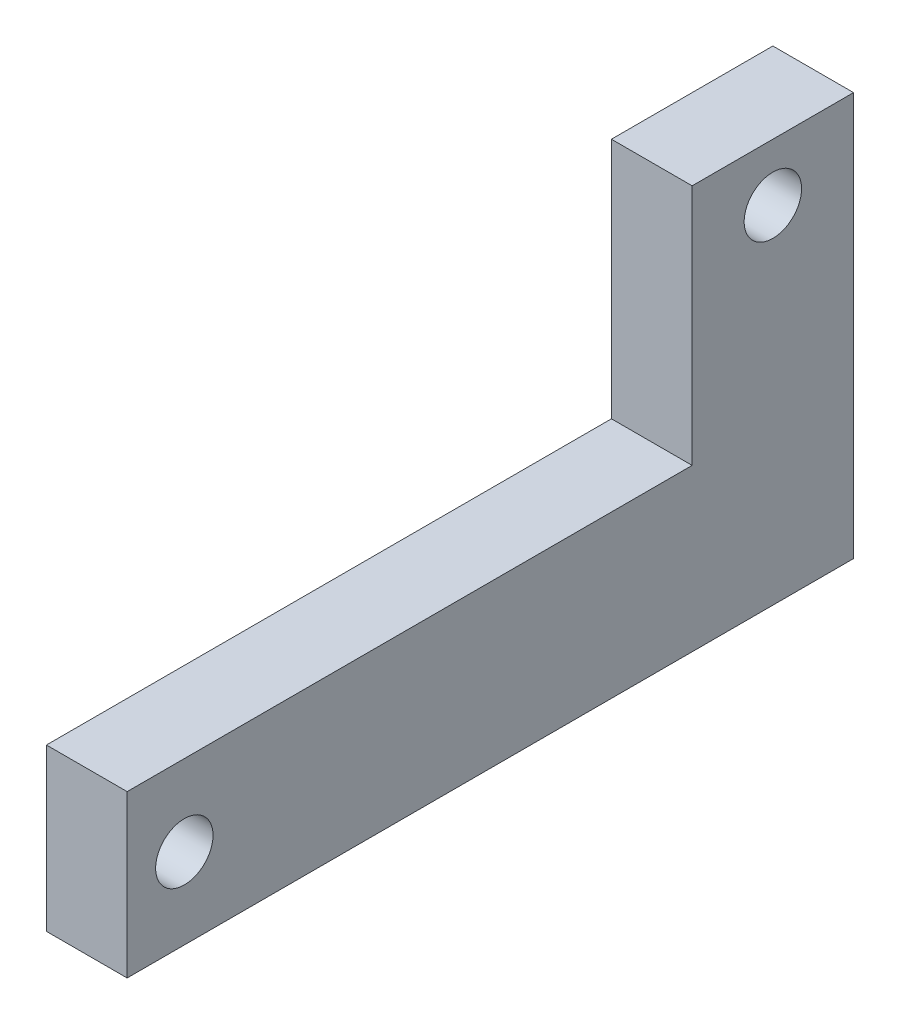
ISO-10303-21;
HEADER;
FILE_DESCRIPTION(('STEP AP214'),'2;1');
FILE_NAME('part.step','',(''),(''),'','','');
FILE_SCHEMA(('AUTOMOTIVE_DESIGN { 1 0 10303 214 1 1 1 1 }'));
ENDSEC;
DATA;
#1=APPLICATION_CONTEXT('core data for automotive mechanical design processes');
#2=APPLICATION_PROTOCOL_DEFINITION('international standard','automotive_design',2000,#1);
#3=PRODUCT_CONTEXT('',#1,'mechanical');
#4=PRODUCT('Part','Part','',(#3));
#5=PRODUCT_RELATED_PRODUCT_CATEGORY('part','',(#4));
#6=PRODUCT_DEFINITION_FORMATION('','',#4);
#7=PRODUCT_DEFINITION_CONTEXT('part definition',#1,'design');
#8=PRODUCT_DEFINITION('design','',#6,#7);
#9=PRODUCT_DEFINITION_SHAPE('','',#8);
#10=(LENGTH_UNIT() NAMED_UNIT(*) SI_UNIT(.MILLI.,.METRE.));
#11=(NAMED_UNIT(*) PLANE_ANGLE_UNIT() SI_UNIT($,.RADIAN.));
#12=(NAMED_UNIT(*) SI_UNIT($,.STERADIAN.) SOLID_ANGLE_UNIT());
#13=UNCERTAINTY_MEASURE_WITH_UNIT(LENGTH_MEASURE(1.E-05),#10,'distance_accuracy_value','');
#14=(GEOMETRIC_REPRESENTATION_CONTEXT(3) GLOBAL_UNCERTAINTY_ASSIGNED_CONTEXT((#13)) GLOBAL_UNIT_ASSIGNED_CONTEXT((#10,
#11,#12)) REPRESENTATION_CONTEXT('',''));
#15=CARTESIAN_POINT('',(0.,0.,0.));
#16=DIRECTION('',(0.,0.,1.));
#17=DIRECTION('',(1.,0.,0.));
#18=AXIS2_PLACEMENT_3D('',#15,#16,#17);
#19=CARTESIAN_POINT('',(5.,-2.5,40.));
#20=DIRECTION('',(0.,0.,-1.));
#21=DIRECTION('',(0.,1.,0.));
#22=AXIS2_PLACEMENT_3D('',#19,#20,#21);
#23=PLANE('',#22);
#24=DIRECTION('',(0.,-1.,0.));
#25=VECTOR('',#24,1.);
#26=CARTESIAN_POINT('',(0.,-2.5,40.));
#27=LINE('',#26,#25);
#28=CARTESIAN_POINT('',(0.,-2.5,40.));
#29=VERTEX_POINT('',#28);
#30=CARTESIAN_POINT('',(0.,-12.5,40.));
#31=VERTEX_POINT('',#30);
#32=EDGE_CURVE('E130',#29,#31,#27,.T.);
#33=ORIENTED_EDGE('',*,*,#32,.T.);
#34=DIRECTION('',(-1.,0.,0.));
#35=VECTOR('',#34,1.);
#36=CARTESIAN_POINT('',(5.,-12.5,40.));
#37=LINE('',#36,#35);
#38=CARTESIAN_POINT('',(5.,-12.5,40.));
#39=VERTEX_POINT('',#38);
#40=EDGE_CURVE('E11',#39,#31,#37,.T.);
#41=ORIENTED_EDGE('',*,*,#40,.F.);
#42=DIRECTION('',(0.,-1.,0.));
#43=VECTOR('',#42,1.);
#44=CARTESIAN_POINT('',(5.,-2.5,40.));
#45=LINE('',#44,#43);
#46=CARTESIAN_POINT('',(5.,-2.5,40.));
#47=VERTEX_POINT('',#46);
#48=EDGE_CURVE('E148',#47,#39,#45,.T.);
#49=ORIENTED_EDGE('',*,*,#48,.F.);
#50=DIRECTION('',(-1.,0.,0.));
#51=VECTOR('',#50,1.);
#52=CARTESIAN_POINT('',(5.,-2.5,40.));
#53=LINE('',#52,#51);
#54=EDGE_CURVE('E126',#47,#29,#53,.T.);
#55=ORIENTED_EDGE('',*,*,#54,.T.);
#56=EDGE_LOOP('',(#33,#41,#49,#55));
#57=FACE_BOUND('',#56,.T.);
#58=ADVANCED_FACE('F41',(#57),#23,.F.);
#59=CARTESIAN_POINT('',(5.,-12.5,40.));
#60=DIRECTION('',(0.,1.,0.));
#61=DIRECTION('',(0.,0.,1.));
#62=AXIS2_PLACEMENT_3D('',#59,#60,#61);
#63=PLANE('',#62);
#64=DIRECTION('',(0.,0.,-1.));
#65=VECTOR('',#64,1.);
#66=CARTESIAN_POINT('',(0.,-12.5,40.));
#67=LINE('',#66,#65);
#68=CARTESIAN_POINT('',(0.,-12.5,-5.));
#69=VERTEX_POINT('',#68);
#70=EDGE_CURVE('E134',#31,#69,#67,.T.);
#71=ORIENTED_EDGE('',*,*,#70,.T.);
#72=DIRECTION('',(-1.,0.,0.));
#73=VECTOR('',#72,1.);
#74=CARTESIAN_POINT('',(5.,-12.5,-5.));
#75=LINE('',#74,#73);
#76=CARTESIAN_POINT('',(5.,-12.5,-5.));
#77=VERTEX_POINT('',#76);
#78=EDGE_CURVE('E50',#77,#69,#75,.T.);
#79=ORIENTED_EDGE('',*,*,#78,.F.);
#80=DIRECTION('',(0.,0.,-1.));
#81=VECTOR('',#80,1.);
#82=CARTESIAN_POINT('',(5.,-12.5,40.));
#83=LINE('',#82,#81);
#84=EDGE_CURVE('E95',#39,#77,#83,.T.);
#85=ORIENTED_EDGE('',*,*,#84,.F.);
#86=ORIENTED_EDGE('',*,*,#40,.T.);
#87=EDGE_LOOP('',(#71,#79,#85,#86));
#88=FACE_BOUND('',#87,.T.);
#89=ADVANCED_FACE('F158',(#88),#63,.F.);
#90=CARTESIAN_POINT('',(5.,-2.5,-5.));
#91=DIRECTION('',(0.,0.,1.));
#92=DIRECTION('',(1.,0.,0.));
#93=AXIS2_PLACEMENT_3D('',#90,#91,#92);
#94=PLANE('',#93);
#95=DIRECTION('',(0.,1.,0.));
#96=VECTOR('',#95,1.);
#97=CARTESIAN_POINT('',(0.,-2.5,-5.));
#98=LINE('',#97,#96);
#99=CARTESIAN_POINT('',(0.,12.5,-5.));
#100=VERTEX_POINT('',#99);
#101=EDGE_CURVE('E139',#69,#100,#98,.T.);
#102=ORIENTED_EDGE('',*,*,#101,.T.);
#103=DIRECTION('',(-1.,0.,0.));
#104=VECTOR('',#103,1.);
#105=CARTESIAN_POINT('',(5.,12.5,-5.));
#106=LINE('',#105,#104);
#107=CARTESIAN_POINT('',(5.,12.5,-5.));
#108=VERTEX_POINT('',#107);
#109=EDGE_CURVE('E119',#108,#100,#106,.T.);
#110=ORIENTED_EDGE('',*,*,#109,.F.);
#111=DIRECTION('',(0.,1.,0.));
#112=VECTOR('',#111,1.);
#113=CARTESIAN_POINT('',(5.,-2.5,-5.));
#114=LINE('',#113,#112);
#115=EDGE_CURVE('E108',#77,#108,#114,.T.);
#116=ORIENTED_EDGE('',*,*,#115,.F.);
#117=ORIENTED_EDGE('',*,*,#78,.T.);
#118=EDGE_LOOP('',(#102,#110,#116,#117));
#119=FACE_BOUND('',#118,.T.);
#120=ADVANCED_FACE('F157',(#119),#94,.F.);
#121=CARTESIAN_POINT('',(5.,12.5,-5.));
#122=DIRECTION('',(0.,-1.,0.));
#123=DIRECTION('',(0.,0.,-1.));
#124=AXIS2_PLACEMENT_3D('',#121,#122,#123);
#125=PLANE('',#124);
#126=DIRECTION('',(0.,0.,1.));
#127=VECTOR('',#126,1.);
#128=CARTESIAN_POINT('',(0.,12.5,-5.));
#129=LINE('',#128,#127);
#130=CARTESIAN_POINT('',(0.,12.5,5.));
#131=VERTEX_POINT('',#130);
#132=EDGE_CURVE('E117',#100,#131,#129,.T.);
#133=ORIENTED_EDGE('',*,*,#132,.T.);
#134=DIRECTION('',(-1.,0.,0.));
#135=VECTOR('',#134,1.);
#136=CARTESIAN_POINT('',(5.,12.5,5.));
#137=LINE('',#136,#135);
#138=CARTESIAN_POINT('',(5.,12.5,5.));
#139=VERTEX_POINT('',#138);
#140=EDGE_CURVE('E114',#139,#131,#137,.T.);
#141=ORIENTED_EDGE('',*,*,#140,.F.);
#142=DIRECTION('',(0.,0.,1.));
#143=VECTOR('',#142,1.);
#144=CARTESIAN_POINT('',(5.,12.5,-5.));
#145=LINE('',#144,#143);
#146=EDGE_CURVE('E102',#108,#139,#145,.T.);
#147=ORIENTED_EDGE('',*,*,#146,.F.);
#148=ORIENTED_EDGE('',*,*,#109,.T.);
#149=EDGE_LOOP('',(#133,#141,#147,#148));
#150=FACE_BOUND('',#149,.T.);
#151=ADVANCED_FACE('F115',(#150),#125,.F.);
#152=CARTESIAN_POINT('',(5.,-2.5,4.99999999999999));
#153=DIRECTION('',(0.,0.,-1.));
#154=DIRECTION('',(0.,1.,0.));
#155=AXIS2_PLACEMENT_3D('',#152,#153,#154);
#156=PLANE('',#155);
#157=DIRECTION('',(0.,-1.,0.));
#158=VECTOR('',#157,1.);
#159=CARTESIAN_POINT('',(0.,-2.5,4.99999999999999));
#160=LINE('',#159,#158);
#161=CARTESIAN_POINT('',(0.,-2.5,4.99999999999999));
#162=VERTEX_POINT('',#161);
#163=EDGE_CURVE('E81',#131,#162,#160,.T.);
#164=ORIENTED_EDGE('',*,*,#163,.T.);
#165=DIRECTION('',(-1.,0.,0.));
#166=VECTOR('',#165,1.);
#167=CARTESIAN_POINT('',(5.,-2.5,4.99999999999999));
#168=LINE('',#167,#166);
#169=CARTESIAN_POINT('',(5.,-2.5,4.99999999999999));
#170=VERTEX_POINT('',#169);
#171=EDGE_CURVE('E120',#170,#162,#168,.T.);
#172=ORIENTED_EDGE('',*,*,#171,.F.);
#173=DIRECTION('',(0.,-1.,0.));
#174=VECTOR('',#173,1.);
#175=CARTESIAN_POINT('',(5.,-2.5,4.99999999999999));
#176=LINE('',#175,#174);
#177=EDGE_CURVE('E106',#139,#170,#176,.T.);
#178=ORIENTED_EDGE('',*,*,#177,.F.);
#179=ORIENTED_EDGE('',*,*,#140,.T.);
#180=EDGE_LOOP('',(#164,#172,#178,#179));
#181=FACE_BOUND('',#180,.T.);
#182=ADVANCED_FACE('F122',(#181),#156,.F.);
#183=CARTESIAN_POINT('',(5.,-2.5,40.));
#184=DIRECTION('',(0.,-1.,0.));
#185=DIRECTION('',(0.,0.,-1.));
#186=AXIS2_PLACEMENT_3D('',#183,#184,#185);
#187=PLANE('',#186);
#188=DIRECTION('',(0.,0.,1.));
#189=VECTOR('',#188,1.);
#190=CARTESIAN_POINT('',(0.,-2.5,40.));
#191=LINE('',#190,#189);
#192=EDGE_CURVE('E87',#162,#29,#191,.T.);
#193=ORIENTED_EDGE('',*,*,#192,.T.);
#194=ORIENTED_EDGE('',*,*,#54,.F.);
#195=DIRECTION('',(0.,0.,1.));
#196=VECTOR('',#195,1.);
#197=CARTESIAN_POINT('',(5.,-2.5,40.));
#198=LINE('',#197,#196);
#199=EDGE_CURVE('E58',#170,#47,#198,.T.);
#200=ORIENTED_EDGE('',*,*,#199,.F.);
#201=ORIENTED_EDGE('',*,*,#171,.T.);
#202=EDGE_LOOP('',(#193,#194,#200,#201));
#203=FACE_BOUND('',#202,.T.);
#204=ADVANCED_FACE('F165',(#203),#187,.F.);
#205=CARTESIAN_POINT('',(5.,0.,0.));
#206=DIRECTION('',(1.,0.,0.));
#207=DIRECTION('',(0.,0.,-1.));
#208=AXIS2_PLACEMENT_3D('',#205,#206,#207);
#209=PLANE('',#208);
#210=CARTESIAN_POINT('',(5.,8.9575131106459,0.));
#211=DIRECTION('',(1.,0.,0.));
#212=DIRECTION('',(0.,0.,-1.));
#213=AXIS2_PLACEMENT_3D('',#210,#211,#212);
#214=CIRCLE('',#213,1.77799999999999);
#215=CARTESIAN_POINT('',(5.,8.9575131106459,-1.77799999999999));
#216=VERTEX_POINT('',#215);
#217=EDGE_CURVE('E242',#216,#216,#214,.T.);
#218=ORIENTED_EDGE('',*,*,#217,.F.);
#219=EDGE_LOOP('',(#218));
#220=FACE_BOUND('',#219,.T.);
#221=CARTESIAN_POINT('',(5.,-7.5,36.4575131106459));
#222=DIRECTION('',(1.,0.,0.));
#223=DIRECTION('',(0.,0.,-1.));
#224=AXIS2_PLACEMENT_3D('',#221,#222,#223);
#225=CIRCLE('',#224,1.77799999999999);
#226=CARTESIAN_POINT('',(5.,-7.5,34.6795131106459));
#227=VERTEX_POINT('',#226);
#228=EDGE_CURVE('E246',#227,#227,#225,.T.);
#229=ORIENTED_EDGE('',*,*,#228,.F.);
#230=EDGE_LOOP('',(#229));
#231=FACE_BOUND('',#230,.T.);
#232=ORIENTED_EDGE('',*,*,#48,.T.);
#233=ORIENTED_EDGE('',*,*,#84,.T.);
#234=ORIENTED_EDGE('',*,*,#115,.T.);
#235=ORIENTED_EDGE('',*,*,#146,.T.);
#236=ORIENTED_EDGE('',*,*,#177,.T.);
#237=ORIENTED_EDGE('',*,*,#199,.T.);
#238=EDGE_LOOP('',(#232,#233,#234,#235,#236,#237));
#239=FACE_BOUND('',#238,.T.);
#240=ADVANCED_FACE('F104',(#220,#231,#239),#209,.T.);
#241=CARTESIAN_POINT('',(0.,0.,0.));
#242=DIRECTION('',(1.,0.,0.));
#243=DIRECTION('',(0.,0.,-1.));
#244=AXIS2_PLACEMENT_3D('',#241,#242,#243);
#245=PLANE('',#244);
#246=CARTESIAN_POINT('',(0.,8.9575131106459,0.));
#247=DIRECTION('',(1.,0.,0.));
#248=DIRECTION('',(0.,0.,-1.));
#249=AXIS2_PLACEMENT_3D('',#246,#247,#248);
#250=CIRCLE('',#249,1.77799999999999);
#251=CARTESIAN_POINT('',(0.,8.9575131106459,-1.77799999999999));
#252=VERTEX_POINT('',#251);
#253=EDGE_CURVE('E239',#252,#252,#250,.T.);
#254=ORIENTED_EDGE('',*,*,#253,.T.);
#255=EDGE_LOOP('',(#254));
#256=FACE_BOUND('',#255,.T.);
#257=CARTESIAN_POINT('',(0.,-7.5,36.4575131106459));
#258=DIRECTION('',(1.,0.,0.));
#259=DIRECTION('',(0.,0.,-1.));
#260=AXIS2_PLACEMENT_3D('',#257,#258,#259);
#261=CIRCLE('',#260,1.77799999999999);
#262=CARTESIAN_POINT('',(0.,-7.5,34.6795131106459));
#263=VERTEX_POINT('',#262);
#264=EDGE_CURVE('E135',#263,#263,#261,.T.);
#265=ORIENTED_EDGE('',*,*,#264,.T.);
#266=EDGE_LOOP('',(#265));
#267=FACE_BOUND('',#266,.T.);
#268=ORIENTED_EDGE('',*,*,#32,.F.);
#269=ORIENTED_EDGE('',*,*,#192,.F.);
#270=ORIENTED_EDGE('',*,*,#163,.F.);
#271=ORIENTED_EDGE('',*,*,#132,.F.);
#272=ORIENTED_EDGE('',*,*,#101,.F.);
#273=ORIENTED_EDGE('',*,*,#70,.F.);
#274=EDGE_LOOP('',(#268,#269,#270,#271,#272,#273));
#275=FACE_BOUND('',#274,.T.);
#276=ADVANCED_FACE('F162',(#256,#267,#275),#245,.F.);
#277=CARTESIAN_POINT('',(5.,-7.5,36.4575131106459));
#278=DIRECTION('',(1.,0.,0.));
#279=DIRECTION('',(0.,0.,-1.));
#280=AXIS2_PLACEMENT_3D('',#277,#278,#279);
#281=CYLINDRICAL_SURFACE('',#280,1.77799999999999);
#282=ORIENTED_EDGE('',*,*,#264,.F.);
#283=EDGE_LOOP('',(#282));
#284=FACE_BOUND('',#283,.T.);
#285=ORIENTED_EDGE('',*,*,#228,.T.);
#286=EDGE_LOOP('',(#285));
#287=FACE_BOUND('',#286,.T.);
#288=ADVANCED_FACE('F213',(#284,#287),#281,.F.);
#289=CARTESIAN_POINT('',(5.,8.9575131106459,0.));
#290=DIRECTION('',(1.,0.,0.));
#291=DIRECTION('',(0.,0.,-1.));
#292=AXIS2_PLACEMENT_3D('',#289,#290,#291);
#293=CYLINDRICAL_SURFACE('',#292,1.77799999999999);
#294=ORIENTED_EDGE('',*,*,#253,.F.);
#295=EDGE_LOOP('',(#294));
#296=FACE_BOUND('',#295,.T.);
#297=ORIENTED_EDGE('',*,*,#217,.T.);
#298=EDGE_LOOP('',(#297));
#299=FACE_BOUND('',#298,.T.);
#300=ADVANCED_FACE('F222',(#296,#299),#293,.F.);
#301=CLOSED_SHELL('',(#58,#89,#120,#151,#182,#204,#240,#276,#288,#300));
#302=MANIFOLD_SOLID_BREP('B2',#301);
#303=ADVANCED_BREP_SHAPE_REPRESENTATION('',(#18,#302),#14);
#304=SHAPE_DEFINITION_REPRESENTATION(#9,#303);
ENDSEC;
END-ISO-10303-21;
